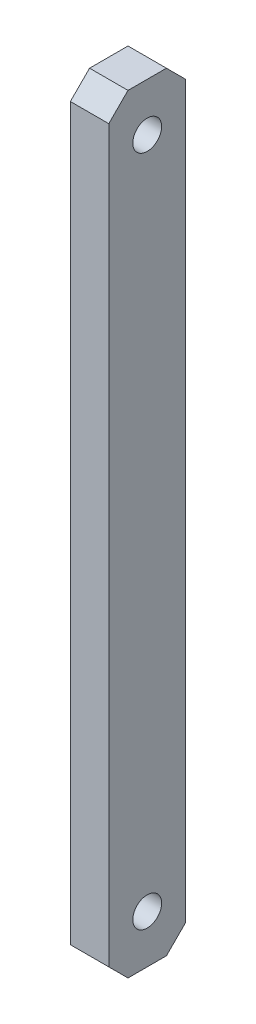
ISO-10303-21;
HEADER;
FILE_DESCRIPTION(('STEP AP214'),'2;1');
FILE_NAME('part.step','',(''),(''),'','','');
FILE_SCHEMA(('AUTOMOTIVE_DESIGN { 1 0 10303 214 1 1 1 1 }'));
ENDSEC;
DATA;
#1=APPLICATION_CONTEXT('core data for automotive mechanical design processes');
#2=APPLICATION_PROTOCOL_DEFINITION('international standard','automotive_design',2000,#1);
#3=PRODUCT_CONTEXT('',#1,'mechanical');
#4=PRODUCT('Part','Part','',(#3));
#5=PRODUCT_RELATED_PRODUCT_CATEGORY('part','',(#4));
#6=PRODUCT_DEFINITION_FORMATION('','',#4);
#7=PRODUCT_DEFINITION_CONTEXT('part definition',#1,'design');
#8=PRODUCT_DEFINITION('design','',#6,#7);
#9=PRODUCT_DEFINITION_SHAPE('','',#8);
#10=(LENGTH_UNIT() NAMED_UNIT(*) SI_UNIT(.MILLI.,.METRE.));
#11=(NAMED_UNIT(*) PLANE_ANGLE_UNIT() SI_UNIT($,.RADIAN.));
#12=(NAMED_UNIT(*) SI_UNIT($,.STERADIAN.) SOLID_ANGLE_UNIT());
#13=UNCERTAINTY_MEASURE_WITH_UNIT(LENGTH_MEASURE(1.E-05),#10,'distance_accuracy_value','');
#14=(GEOMETRIC_REPRESENTATION_CONTEXT(3) GLOBAL_UNCERTAINTY_ASSIGNED_CONTEXT((#13)) GLOBAL_UNIT_ASSIGNED_CONTEXT((#10,
#11,#12)) REPRESENTATION_CONTEXT('',''));
#15=CARTESIAN_POINT('',(0.,0.,0.));
#16=DIRECTION('',(0.,0.,1.));
#17=DIRECTION('',(1.,0.,0.));
#18=AXIS2_PLACEMENT_3D('',#15,#16,#17);
#19=CARTESIAN_POINT('',(4.,0.,0.));
#20=DIRECTION('',(-1.,0.,0.));
#21=DIRECTION('',(0.,0.,1.));
#22=AXIS2_PLACEMENT_3D('',#19,#20,#21);
#23=PLANE('',#22);
#24=DIRECTION('',(0.,0.,-1.));
#25=VECTOR('',#24,1.);
#26=CARTESIAN_POINT('',(4.,-40.,4.));
#27=LINE('',#26,#25);
#28=CARTESIAN_POINT('',(4.,-40.,2.));
#29=VERTEX_POINT('',#28);
#30=CARTESIAN_POINT('',(4.,-40.,-1.99999999999999));
#31=VERTEX_POINT('',#30);
#32=EDGE_CURVE('E157',#29,#31,#27,.T.);
#33=ORIENTED_EDGE('',*,*,#32,.T.);
#34=DIRECTION('',(0.,-0.707106781186545,0.70710678118655));
#35=VECTOR('',#34,1.);
#36=CARTESIAN_POINT('',(4.,-38.,-4.));
#37=LINE('',#36,#35);
#38=CARTESIAN_POINT('',(4.,-38.,-4.));
#39=VERTEX_POINT('',#38);
#40=EDGE_CURVE('E187',#31,#39,#37,.F.);
#41=ORIENTED_EDGE('',*,*,#40,.T.);
#42=DIRECTION('',(0.,1.,0.));
#43=VECTOR('',#42,1.);
#44=CARTESIAN_POINT('',(4.,-40.,-4.));
#45=LINE('',#44,#43);
#46=CARTESIAN_POINT('',(4.,38.,-4.));
#47=VERTEX_POINT('',#46);
#48=EDGE_CURVE('E136',#39,#47,#45,.T.);
#49=ORIENTED_EDGE('',*,*,#48,.T.);
#50=DIRECTION('',(0.,-0.707106781186549,-0.707106781186546));
#51=VECTOR('',#50,1.);
#52=CARTESIAN_POINT('',(4.,40.,-2.00000000000001));
#53=LINE('',#52,#51);
#54=CARTESIAN_POINT('',(4.,40.,-2.00000000000001));
#55=VERTEX_POINT('',#54);
#56=EDGE_CURVE('E179',#47,#55,#53,.F.);
#57=ORIENTED_EDGE('',*,*,#56,.T.);
#58=DIRECTION('',(0.,0.,1.));
#59=VECTOR('',#58,1.);
#60=CARTESIAN_POINT('',(4.,40.,4.));
#61=LINE('',#60,#59);
#62=CARTESIAN_POINT('',(4.,40.,1.99999999999999));
#63=VERTEX_POINT('',#62);
#64=EDGE_CURVE('E202',#55,#63,#61,.T.);
#65=ORIENTED_EDGE('',*,*,#64,.T.);
#66=DIRECTION('',(0.,0.707106781186546,-0.707106781186549));
#67=VECTOR('',#66,1.);
#68=CARTESIAN_POINT('',(4.,38.,4.));
#69=LINE('',#68,#67);
#70=CARTESIAN_POINT('',(4.,38.,4.));
#71=VERTEX_POINT('',#70);
#72=EDGE_CURVE('E71',#63,#71,#69,.F.);
#73=ORIENTED_EDGE('',*,*,#72,.T.);
#74=DIRECTION('',(0.,-1.,0.));
#75=VECTOR('',#74,1.);
#76=CARTESIAN_POINT('',(4.,-40.,4.));
#77=LINE('',#76,#75);
#78=CARTESIAN_POINT('',(4.,-38.,4.));
#79=VERTEX_POINT('',#78);
#80=EDGE_CURVE('E210',#71,#79,#77,.T.);
#81=ORIENTED_EDGE('',*,*,#80,.T.);
#82=DIRECTION('',(0.,0.70710678118655,0.707106781186545));
#83=VECTOR('',#82,1.);
#84=CARTESIAN_POINT('',(4.,-40.,2.));
#85=LINE('',#84,#83);
#86=EDGE_CURVE('E184',#79,#29,#85,.F.);
#87=ORIENTED_EDGE('',*,*,#86,.T.);
#88=EDGE_LOOP('',(#33,#41,#49,#57,#65,#73,#81,#87));
#89=FACE_BOUND('',#88,.T.);
#90=CARTESIAN_POINT('',(4.,-35.,0.));
#91=DIRECTION('',(1.,0.,0.));
#92=DIRECTION('',(0.,0.,-1.));
#93=AXIS2_PLACEMENT_3D('',#90,#91,#92);
#94=CIRCLE('',#93,1.5);
#95=CARTESIAN_POINT('',(4.,-35.,-1.50000000000001));
#96=VERTEX_POINT('',#95);
#97=EDGE_CURVE('E146',#96,#96,#94,.T.);
#98=ORIENTED_EDGE('',*,*,#97,.F.);
#99=EDGE_LOOP('',(#98));
#100=FACE_BOUND('',#99,.T.);
#101=CARTESIAN_POINT('',(4.,35.,0.));
#102=DIRECTION('',(1.,0.,0.));
#103=DIRECTION('',(0.,0.,-1.));
#104=AXIS2_PLACEMENT_3D('',#101,#102,#103);
#105=CIRCLE('',#104,1.5);
#106=CARTESIAN_POINT('',(4.,35.,-1.50000000000001));
#107=VERTEX_POINT('',#106);
#108=EDGE_CURVE('E222',#107,#107,#105,.T.);
#109=ORIENTED_EDGE('',*,*,#108,.F.);
#110=EDGE_LOOP('',(#109));
#111=FACE_BOUND('',#110,.T.);
#112=ADVANCED_FACE('F47',(#89,#100,#111),#23,.F.);
#113=CARTESIAN_POINT('',(0.,0.,0.));
#114=DIRECTION('',(-1.,0.,0.));
#115=DIRECTION('',(0.,0.,1.));
#116=AXIS2_PLACEMENT_3D('',#113,#114,#115);
#117=PLANE('',#116);
#118=CARTESIAN_POINT('',(0.,-35.,0.));
#119=DIRECTION('',(1.,0.,0.));
#120=DIRECTION('',(0.,0.,-1.));
#121=AXIS2_PLACEMENT_3D('',#118,#119,#120);
#122=CIRCLE('',#121,1.5);
#123=CARTESIAN_POINT('',(0.,-35.,-1.50000000000001));
#124=VERTEX_POINT('',#123);
#125=EDGE_CURVE('E154',#124,#124,#122,.T.);
#126=ORIENTED_EDGE('',*,*,#125,.T.);
#127=EDGE_LOOP('',(#126));
#128=FACE_BOUND('',#127,.T.);
#129=DIRECTION('',(0.,1.,0.));
#130=VECTOR('',#129,1.);
#131=CARTESIAN_POINT('',(0.,-40.,-4.));
#132=LINE('',#131,#130);
#133=CARTESIAN_POINT('',(0.,-38.,-4.));
#134=VERTEX_POINT('',#133);
#135=CARTESIAN_POINT('',(0.,38.,-4.));
#136=VERTEX_POINT('',#135);
#137=EDGE_CURVE('E133',#134,#136,#132,.T.);
#138=ORIENTED_EDGE('',*,*,#137,.F.);
#139=DIRECTION('',(0.,0.707106781186545,-0.70710678118655));
#140=VECTOR('',#139,1.);
#141=CARTESIAN_POINT('',(0.,-21.0000000000001,-21.));
#142=LINE('',#141,#140);
#143=CARTESIAN_POINT('',(0.,-40.,-1.99999999999999));
#144=VERTEX_POINT('',#143);
#145=EDGE_CURVE('E115',#134,#144,#142,.F.);
#146=ORIENTED_EDGE('',*,*,#145,.T.);
#147=DIRECTION('',(0.,0.,-1.));
#148=VECTOR('',#147,1.);
#149=CARTESIAN_POINT('',(0.,-40.,4.));
#150=LINE('',#149,#148);
#151=CARTESIAN_POINT('',(0.,-40.,2.));
#152=VERTEX_POINT('',#151);
#153=EDGE_CURVE('E162',#152,#144,#150,.T.);
#154=ORIENTED_EDGE('',*,*,#153,.F.);
#155=DIRECTION('',(0.,-0.70710678118655,-0.707106781186545));
#156=VECTOR('',#155,1.);
#157=CARTESIAN_POINT('',(0.,-20.9999999999999,21.));
#158=LINE('',#157,#156);
#159=CARTESIAN_POINT('',(0.,-38.,4.));
#160=VERTEX_POINT('',#159);
#161=EDGE_CURVE('E127',#152,#160,#158,.F.);
#162=ORIENTED_EDGE('',*,*,#161,.T.);
#163=DIRECTION('',(0.,-1.,0.));
#164=VECTOR('',#163,1.);
#165=CARTESIAN_POINT('',(0.,-40.,4.));
#166=LINE('',#165,#164);
#167=CARTESIAN_POINT('',(0.,38.,4.));
#168=VERTEX_POINT('',#167);
#169=EDGE_CURVE('E151',#168,#160,#166,.T.);
#170=ORIENTED_EDGE('',*,*,#169,.F.);
#171=DIRECTION('',(0.,-0.707106781186546,0.707106781186549));
#172=VECTOR('',#171,1.);
#173=CARTESIAN_POINT('',(0.,21.0000000000001,21.));
#174=LINE('',#173,#172);
#175=CARTESIAN_POINT('',(0.,40.,1.99999999999999));
#176=VERTEX_POINT('',#175);
#177=EDGE_CURVE('E169',#168,#176,#174,.F.);
#178=ORIENTED_EDGE('',*,*,#177,.T.);
#179=DIRECTION('',(0.,0.,1.));
#180=VECTOR('',#179,1.);
#181=CARTESIAN_POINT('',(0.,40.,4.));
#182=LINE('',#181,#180);
#183=CARTESIAN_POINT('',(0.,40.,-2.00000000000001));
#184=VERTEX_POINT('',#183);
#185=EDGE_CURVE('E145',#184,#176,#182,.T.);
#186=ORIENTED_EDGE('',*,*,#185,.F.);
#187=DIRECTION('',(0.,0.707106781186549,0.707106781186546));
#188=VECTOR('',#187,1.);
#189=CARTESIAN_POINT('',(0.,20.9999999999999,-21.));
#190=LINE('',#189,#188);
#191=EDGE_CURVE('E138',#184,#136,#190,.F.);
#192=ORIENTED_EDGE('',*,*,#191,.T.);
#193=EDGE_LOOP('',(#138,#146,#154,#162,#170,#178,#186,#192));
#194=FACE_BOUND('',#193,.T.);
#195=CARTESIAN_POINT('',(0.,35.,0.));
#196=DIRECTION('',(1.,0.,0.));
#197=DIRECTION('',(0.,0.,-1.));
#198=AXIS2_PLACEMENT_3D('',#195,#196,#197);
#199=CIRCLE('',#198,1.5);
#200=CARTESIAN_POINT('',(0.,35.,-1.50000000000001));
#201=VERTEX_POINT('',#200);
#202=EDGE_CURVE('E224',#201,#201,#199,.T.);
#203=ORIENTED_EDGE('',*,*,#202,.T.);
#204=EDGE_LOOP('',(#203));
#205=FACE_BOUND('',#204,.T.);
#206=ADVANCED_FACE('F141',(#128,#194,#205),#117,.T.);
#207=CARTESIAN_POINT('',(4.,-40.,-4.));
#208=DIRECTION('',(0.,0.,1.));
#209=DIRECTION('',(1.,0.,0.));
#210=AXIS2_PLACEMENT_3D('',#207,#208,#209);
#211=PLANE('',#210);
#212=ORIENTED_EDGE('',*,*,#48,.F.);
#213=DIRECTION('',(-1.,0.,0.));
#214=VECTOR('',#213,1.);
#215=CARTESIAN_POINT('',(4.,-38.,-4.));
#216=LINE('',#215,#214);
#217=EDGE_CURVE('E119',#39,#134,#216,.T.);
#218=ORIENTED_EDGE('',*,*,#217,.T.);
#219=ORIENTED_EDGE('',*,*,#137,.T.);
#220=DIRECTION('',(1.,0.,0.));
#221=VECTOR('',#220,1.);
#222=CARTESIAN_POINT('',(4.,38.,-4.));
#223=LINE('',#222,#221);
#224=EDGE_CURVE('E139',#136,#47,#223,.T.);
#225=ORIENTED_EDGE('',*,*,#224,.T.);
#226=EDGE_LOOP('',(#212,#218,#219,#225));
#227=FACE_BOUND('',#226,.T.);
#228=ADVANCED_FACE('F132',(#227),#211,.F.);
#229=CARTESIAN_POINT('',(4.,40.,4.));
#230=DIRECTION('',(0.,-1.,0.));
#231=DIRECTION('',(0.,0.,-1.));
#232=AXIS2_PLACEMENT_3D('',#229,#230,#231);
#233=PLANE('',#232);
#234=ORIENTED_EDGE('',*,*,#185,.T.);
#235=DIRECTION('',(1.,0.,0.));
#236=VECTOR('',#235,1.);
#237=CARTESIAN_POINT('',(4.,40.,1.99999999999999));
#238=LINE('',#237,#236);
#239=EDGE_CURVE('E11',#176,#63,#238,.T.);
#240=ORIENTED_EDGE('',*,*,#239,.T.);
#241=ORIENTED_EDGE('',*,*,#64,.F.);
#242=DIRECTION('',(-1.,0.,0.));
#243=VECTOR('',#242,1.);
#244=CARTESIAN_POINT('',(4.,40.,-2.00000000000001));
#245=LINE('',#244,#243);
#246=EDGE_CURVE('E57',#55,#184,#245,.T.);
#247=ORIENTED_EDGE('',*,*,#246,.T.);
#248=EDGE_LOOP('',(#234,#240,#241,#247));
#249=FACE_BOUND('',#248,.T.);
#250=ADVANCED_FACE('F200',(#249),#233,.F.);
#251=CARTESIAN_POINT('',(4.,-40.,4.));
#252=DIRECTION('',(0.,0.,-1.));
#253=DIRECTION('',(-1.,0.,0.));
#254=AXIS2_PLACEMENT_3D('',#251,#252,#253);
#255=PLANE('',#254);
#256=ORIENTED_EDGE('',*,*,#169,.T.);
#257=DIRECTION('',(1.,0.,0.));
#258=VECTOR('',#257,1.);
#259=CARTESIAN_POINT('',(4.,-38.,4.));
#260=LINE('',#259,#258);
#261=EDGE_CURVE('E64',#160,#79,#260,.T.);
#262=ORIENTED_EDGE('',*,*,#261,.T.);
#263=ORIENTED_EDGE('',*,*,#80,.F.);
#264=DIRECTION('',(-1.,0.,0.));
#265=VECTOR('',#264,1.);
#266=CARTESIAN_POINT('',(4.,38.,4.));
#267=LINE('',#266,#265);
#268=EDGE_CURVE('E190',#71,#168,#267,.T.);
#269=ORIENTED_EDGE('',*,*,#268,.T.);
#270=EDGE_LOOP('',(#256,#262,#263,#269));
#271=FACE_BOUND('',#270,.T.);
#272=ADVANCED_FACE('F209',(#271),#255,.F.);
#273=CARTESIAN_POINT('',(4.,-40.,4.));
#274=DIRECTION('',(0.,1.,0.));
#275=DIRECTION('',(0.,0.,1.));
#276=AXIS2_PLACEMENT_3D('',#273,#274,#275);
#277=PLANE('',#276);
#278=ORIENTED_EDGE('',*,*,#153,.T.);
#279=DIRECTION('',(1.,0.,0.));
#280=VECTOR('',#279,1.);
#281=CARTESIAN_POINT('',(4.,-40.,-1.99999999999999));
#282=LINE('',#281,#280);
#283=EDGE_CURVE('E120',#144,#31,#282,.T.);
#284=ORIENTED_EDGE('',*,*,#283,.T.);
#285=ORIENTED_EDGE('',*,*,#32,.F.);
#286=DIRECTION('',(-1.,0.,0.));
#287=VECTOR('',#286,1.);
#288=CARTESIAN_POINT('',(4.,-40.,2.));
#289=LINE('',#288,#287);
#290=EDGE_CURVE('E126',#29,#152,#289,.T.);
#291=ORIENTED_EDGE('',*,*,#290,.T.);
#292=EDGE_LOOP('',(#278,#284,#285,#291));
#293=FACE_BOUND('',#292,.T.);
#294=ADVANCED_FACE('F247',(#293),#277,.F.);
#295=CARTESIAN_POINT('',(4.,-35.,0.));
#296=DIRECTION('',(-1.,0.,0.));
#297=DIRECTION('',(0.,0.,1.));
#298=AXIS2_PLACEMENT_3D('',#295,#296,#297);
#299=CYLINDRICAL_SURFACE('',#298,1.5);
#300=ORIENTED_EDGE('',*,*,#97,.T.);
#301=EDGE_LOOP('',(#300));
#302=FACE_BOUND('',#301,.T.);
#303=ORIENTED_EDGE('',*,*,#125,.F.);
#304=EDGE_LOOP('',(#303));
#305=FACE_BOUND('',#304,.T.);
#306=ADVANCED_FACE('F244',(#302,#305),#299,.F.);
#307=CARTESIAN_POINT('',(4.,35.,0.));
#308=DIRECTION('',(-1.,0.,0.));
#309=DIRECTION('',(0.,0.,1.));
#310=AXIS2_PLACEMENT_3D('',#307,#308,#309);
#311=CYLINDRICAL_SURFACE('',#310,1.5);
#312=ORIENTED_EDGE('',*,*,#108,.T.);
#313=EDGE_LOOP('',(#312));
#314=FACE_BOUND('',#313,.T.);
#315=ORIENTED_EDGE('',*,*,#202,.F.);
#316=EDGE_LOOP('',(#315));
#317=FACE_BOUND('',#316,.T.);
#318=ADVANCED_FACE('F232',(#314,#317),#311,.F.);
#319=CARTESIAN_POINT('',(4.,-38.,-4.));
#320=DIRECTION('',(0.,0.70710678118655,0.707106781186545));
#321=DIRECTION('',(-1.,0.,0.));
#322=AXIS2_PLACEMENT_3D('',#319,#320,#321);
#323=PLANE('',#322);
#324=ORIENTED_EDGE('',*,*,#40,.F.);
#325=ORIENTED_EDGE('',*,*,#283,.F.);
#326=ORIENTED_EDGE('',*,*,#145,.F.);
#327=ORIENTED_EDGE('',*,*,#217,.F.);
#328=EDGE_LOOP('',(#324,#325,#326,#327));
#329=FACE_BOUND('',#328,.T.);
#330=ADVANCED_FACE('F118',(#329),#323,.F.);
#331=CARTESIAN_POINT('',(4.,-40.,2.));
#332=DIRECTION('',(0.,0.707106781186545,-0.70710678118655));
#333=DIRECTION('',(-1.,0.,0.));
#334=AXIS2_PLACEMENT_3D('',#331,#332,#333);
#335=PLANE('',#334);
#336=ORIENTED_EDGE('',*,*,#86,.F.);
#337=ORIENTED_EDGE('',*,*,#261,.F.);
#338=ORIENTED_EDGE('',*,*,#161,.F.);
#339=ORIENTED_EDGE('',*,*,#290,.F.);
#340=EDGE_LOOP('',(#336,#337,#338,#339));
#341=FACE_BOUND('',#340,.T.);
#342=ADVANCED_FACE('F263',(#341),#335,.F.);
#343=CARTESIAN_POINT('',(4.,38.,4.));
#344=DIRECTION('',(0.,-0.707106781186549,-0.707106781186546));
#345=DIRECTION('',(-1.,0.,0.));
#346=AXIS2_PLACEMENT_3D('',#343,#344,#345);
#347=PLANE('',#346);
#348=ORIENTED_EDGE('',*,*,#72,.F.);
#349=ORIENTED_EDGE('',*,*,#239,.F.);
#350=ORIENTED_EDGE('',*,*,#177,.F.);
#351=ORIENTED_EDGE('',*,*,#268,.F.);
#352=EDGE_LOOP('',(#348,#349,#350,#351));
#353=FACE_BOUND('',#352,.T.);
#354=ADVANCED_FACE('F208',(#353),#347,.F.);
#355=CARTESIAN_POINT('',(4.,40.,-2.00000000000001));
#356=DIRECTION('',(0.,-0.707106781186546,0.707106781186549));
#357=DIRECTION('',(-1.,0.,0.));
#358=AXIS2_PLACEMENT_3D('',#355,#356,#357);
#359=PLANE('',#358);
#360=ORIENTED_EDGE('',*,*,#56,.F.);
#361=ORIENTED_EDGE('',*,*,#224,.F.);
#362=ORIENTED_EDGE('',*,*,#191,.F.);
#363=ORIENTED_EDGE('',*,*,#246,.F.);
#364=EDGE_LOOP('',(#360,#361,#362,#363));
#365=FACE_BOUND('',#364,.T.);
#366=ADVANCED_FACE('F50',(#365),#359,.F.);
#367=CLOSED_SHELL('',(#112,#206,#228,#250,#272,#294,#306,#318,#330,#342,#354,#366));
#368=MANIFOLD_SOLID_BREP('B2',#367);
#369=ADVANCED_BREP_SHAPE_REPRESENTATION('',(#18,#368),#14);
#370=SHAPE_DEFINITION_REPRESENTATION(#9,#369);
ENDSEC;
END-ISO-10303-21;
